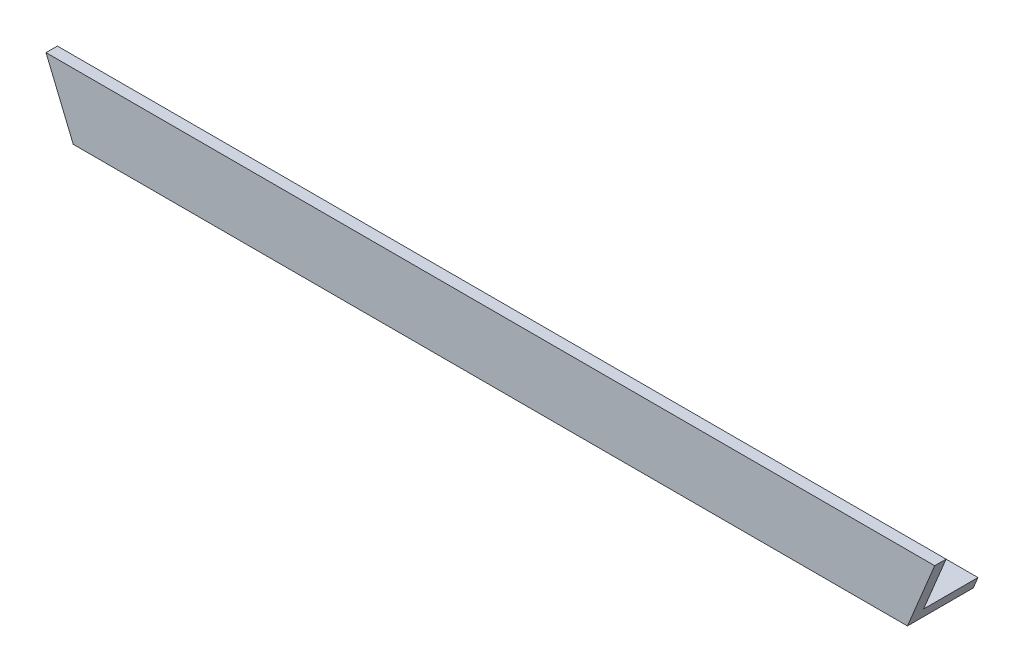
ISO-10303-21;
HEADER;
FILE_DESCRIPTION(('STEP AP214'),'2;1');
FILE_NAME('part.step','',(''),(''),'','','');
FILE_SCHEMA(('AUTOMOTIVE_DESIGN { 1 0 10303 214 1 1 1 1 }'));
ENDSEC;
DATA;
#1=APPLICATION_CONTEXT('core data for automotive mechanical design processes');
#2=APPLICATION_PROTOCOL_DEFINITION('international standard','automotive_design',2000,#1);
#3=PRODUCT_CONTEXT('',#1,'mechanical');
#4=PRODUCT('Part','Part','',(#3));
#5=PRODUCT_RELATED_PRODUCT_CATEGORY('part','',(#4));
#6=PRODUCT_DEFINITION_FORMATION('','',#4);
#7=PRODUCT_DEFINITION_CONTEXT('part definition',#1,'design');
#8=PRODUCT_DEFINITION('design','',#6,#7);
#9=PRODUCT_DEFINITION_SHAPE('','',#8);
#10=(LENGTH_UNIT() NAMED_UNIT(*) SI_UNIT(.MILLI.,.METRE.));
#11=(NAMED_UNIT(*) PLANE_ANGLE_UNIT() SI_UNIT($,.RADIAN.));
#12=(NAMED_UNIT(*) SI_UNIT($,.STERADIAN.) SOLID_ANGLE_UNIT());
#13=UNCERTAINTY_MEASURE_WITH_UNIT(LENGTH_MEASURE(1.E-05),#10,'distance_accuracy_value','');
#14=(GEOMETRIC_REPRESENTATION_CONTEXT(3) GLOBAL_UNCERTAINTY_ASSIGNED_CONTEXT((#13)) GLOBAL_UNIT_ASSIGNED_CONTEXT((#10,
#11,#12)) REPRESENTATION_CONTEXT('',''));
#15=CARTESIAN_POINT('',(0.,0.,0.));
#16=DIRECTION('',(0.,0.,1.));
#17=DIRECTION('',(1.,0.,0.));
#18=AXIS2_PLACEMENT_3D('',#15,#16,#17);
#19=CARTESIAN_POINT('',(270.,20.,0.));
#20=DIRECTION('',(0.,0.,-1.));
#21=DIRECTION('',(0.,1.,0.));
#22=AXIS2_PLACEMENT_3D('',#19,#20,#21);
#23=PLANE('',#22);
#24=DIRECTION('',(0.382683432365092,0.923879532511286,0.));
#25=VECTOR('',#24,1.);
#26=CARTESIAN_POINT('',(270.,20.,0.));
#27=LINE('',#26,#25);
#28=CARTESIAN_POINT('',(261.715728752538,0.,0.));
#29=VERTEX_POINT('',#28);
#30=CARTESIAN_POINT('',(270.,20.,0.));
#31=VERTEX_POINT('',#30);
#32=EDGE_CURVE('E89',#29,#31,#27,.T.);
#33=ORIENTED_EDGE('',*,*,#32,.T.);
#34=DIRECTION('',(-1.,0.,0.));
#35=VECTOR('',#34,1.);
#36=CARTESIAN_POINT('',(270.,20.,0.));
#37=LINE('',#36,#35);
#38=CARTESIAN_POINT('',(0.,20.,0.));
#39=VERTEX_POINT('',#38);
#40=EDGE_CURVE('E114',#31,#39,#37,.T.);
#41=ORIENTED_EDGE('',*,*,#40,.T.);
#42=DIRECTION('',(0.382683432365091,-0.923879532511286,0.));
#43=VECTOR('',#42,1.);
#44=CARTESIAN_POINT('',(0.,20.,0.));
#45=LINE('',#44,#43);
#46=CARTESIAN_POINT('',(8.28427124746192,0.,0.));
#47=VERTEX_POINT('',#46);
#48=EDGE_CURVE('E130',#39,#47,#45,.T.);
#49=ORIENTED_EDGE('',*,*,#48,.T.);
#50=DIRECTION('',(-1.,0.,0.));
#51=VECTOR('',#50,1.);
#52=CARTESIAN_POINT('',(270.,0.,0.));
#53=LINE('',#52,#51);
#54=EDGE_CURVE('E11',#29,#47,#53,.T.);
#55=ORIENTED_EDGE('',*,*,#54,.F.);
#56=EDGE_LOOP('',(#33,#41,#49,#55));
#57=FACE_BOUND('',#56,.T.);
#58=ADVANCED_FACE('F37',(#57),#23,.F.);
#59=CARTESIAN_POINT('',(270.,0.,0.));
#60=DIRECTION('',(0.,1.,0.));
#61=DIRECTION('',(0.,0.,1.));
#62=AXIS2_PLACEMENT_3D('',#59,#60,#61);
#63=PLANE('',#62);
#64=DIRECTION('',(0.,0.,1.));
#65=VECTOR('',#64,1.);
#66=CARTESIAN_POINT('',(261.715728752538,0.,-20.));
#67=LINE('',#66,#65);
#68=CARTESIAN_POINT('',(261.715728752538,0.,-20.));
#69=VERTEX_POINT('',#68);
#70=EDGE_CURVE('E83',#69,#29,#67,.T.);
#71=ORIENTED_EDGE('',*,*,#70,.T.);
#72=ORIENTED_EDGE('',*,*,#54,.T.);
#73=DIRECTION('',(0.,0.,1.));
#74=VECTOR('',#73,1.);
#75=CARTESIAN_POINT('',(8.28427124746192,0.,-20.));
#76=LINE('',#75,#74);
#77=CARTESIAN_POINT('',(8.28427124746192,0.,-20.));
#78=VERTEX_POINT('',#77);
#79=EDGE_CURVE('E105',#78,#47,#76,.T.);
#80=ORIENTED_EDGE('',*,*,#79,.F.);
#81=DIRECTION('',(-1.,0.,0.));
#82=VECTOR('',#81,1.);
#83=CARTESIAN_POINT('',(270.,0.,-20.));
#84=LINE('',#83,#82);
#85=EDGE_CURVE('E45',#69,#78,#84,.T.);
#86=ORIENTED_EDGE('',*,*,#85,.F.);
#87=EDGE_LOOP('',(#71,#72,#80,#86));
#88=FACE_BOUND('',#87,.T.);
#89=ADVANCED_FACE('F104',(#88),#63,.F.);
#90=CARTESIAN_POINT('',(270.,0.,-20.));
#91=DIRECTION('',(0.,0.,1.));
#92=DIRECTION('',(1.,0.,0.));
#93=AXIS2_PLACEMENT_3D('',#90,#91,#92);
#94=PLANE('',#93);
#95=DIRECTION('',(0.382683432365092,0.923879532511286,0.));
#96=VECTOR('',#95,1.);
#97=CARTESIAN_POINT('',(270.,20.,-20.));
#98=LINE('',#97,#96);
#99=CARTESIAN_POINT('',(263.14939581537,3.46117846701572,-20.));
#100=VERTEX_POINT('',#99);
#101=EDGE_CURVE('E86',#69,#100,#98,.T.);
#102=ORIENTED_EDGE('',*,*,#101,.F.);
#103=ORIENTED_EDGE('',*,*,#85,.T.);
#104=DIRECTION('',(0.382683432365091,-0.923879532511286,0.));
#105=VECTOR('',#104,1.);
#106=CARTESIAN_POINT('',(0.,20.,-20.));
#107=LINE('',#106,#105);
#108=CARTESIAN_POINT('',(6.85060418463029,3.46117846701572,-20.));
#109=VERTEX_POINT('',#108);
#110=EDGE_CURVE('E128',#109,#78,#107,.T.);
#111=ORIENTED_EDGE('',*,*,#110,.F.);
#112=DIRECTION('',(-1.,0.,0.));
#113=VECTOR('',#112,1.);
#114=CARTESIAN_POINT('',(270.,3.46117846701572,-20.));
#115=LINE('',#114,#113);
#116=EDGE_CURVE('E101',#100,#109,#115,.T.);
#117=ORIENTED_EDGE('',*,*,#116,.F.);
#118=EDGE_LOOP('',(#102,#103,#111,#117));
#119=FACE_BOUND('',#118,.T.);
#120=ADVANCED_FACE('F98',(#119),#94,.F.);
#121=CARTESIAN_POINT('',(270.,3.46117846701572,-20.));
#122=DIRECTION('',(0.,-1.,0.));
#123=DIRECTION('',(0.,0.,-1.));
#124=AXIS2_PLACEMENT_3D('',#121,#122,#123);
#125=PLANE('',#124);
#126=DIRECTION('',(0.,0.,1.));
#127=VECTOR('',#126,1.);
#128=CARTESIAN_POINT('',(263.14939581537,3.46117846701572,-20.));
#129=LINE('',#128,#127);
#130=CARTESIAN_POINT('',(263.14939581537,3.46117846701572,-3.46117846701572));
#131=VERTEX_POINT('',#130);
#132=EDGE_CURVE('E121',#100,#131,#129,.T.);
#133=ORIENTED_EDGE('',*,*,#132,.F.);
#134=ORIENTED_EDGE('',*,*,#116,.T.);
#135=DIRECTION('',(0.,0.,-1.));
#136=VECTOR('',#135,1.);
#137=CARTESIAN_POINT('',(6.85060418463029,3.46117846701572,-20.));
#138=LINE('',#137,#136);
#139=CARTESIAN_POINT('',(6.8506041846303,3.46117846701571,-3.46117846701572));
#140=VERTEX_POINT('',#139);
#141=EDGE_CURVE('E125',#140,#109,#138,.T.);
#142=ORIENTED_EDGE('',*,*,#141,.F.);
#143=DIRECTION('',(-1.,0.,0.));
#144=VECTOR('',#143,1.);
#145=CARTESIAN_POINT('',(270.,3.46117846701572,-3.46117846701572));
#146=LINE('',#145,#144);
#147=EDGE_CURVE('E106',#131,#140,#146,.T.);
#148=ORIENTED_EDGE('',*,*,#147,.F.);
#149=EDGE_LOOP('',(#133,#134,#142,#148));
#150=FACE_BOUND('',#149,.T.);
#151=ADVANCED_FACE('F147',(#150),#125,.F.);
#152=CARTESIAN_POINT('',(270.,3.46117846701572,-3.46117846701572));
#153=DIRECTION('',(0.,0.,1.));
#154=DIRECTION('',(1.,0.,0.));
#155=AXIS2_PLACEMENT_3D('',#152,#153,#154);
#156=PLANE('',#155);
#157=DIRECTION('',(0.382683432365092,0.923879532511286,0.));
#158=VECTOR('',#157,1.);
#159=CARTESIAN_POINT('',(264.152643570596,5.88323280410424,-3.46117846701572));
#160=LINE('',#159,#158);
#161=CARTESIAN_POINT('',(270.,20.,-3.46117846701572));
#162=VERTEX_POINT('',#161);
#163=EDGE_CURVE('E51',#131,#162,#160,.T.);
#164=ORIENTED_EDGE('',*,*,#163,.F.);
#165=ORIENTED_EDGE('',*,*,#147,.T.);
#166=DIRECTION('',(0.382683432365091,-0.923879532511287,0.));
#167=VECTOR('',#166,1.);
#168=CARTESIAN_POINT('',(45.3879409692199,-89.5761826560799,-3.46117846701572));
#169=LINE('',#168,#167);
#170=CARTESIAN_POINT('',(0.,20.,-3.46117846701572));
#171=VERTEX_POINT('',#170);
#172=EDGE_CURVE('E93',#171,#140,#169,.T.);
#173=ORIENTED_EDGE('',*,*,#172,.F.);
#174=DIRECTION('',(-1.,0.,0.));
#175=VECTOR('',#174,1.);
#176=CARTESIAN_POINT('',(270.,20.,-3.46117846701572));
#177=LINE('',#176,#175);
#178=EDGE_CURVE('E111',#162,#171,#177,.T.);
#179=ORIENTED_EDGE('',*,*,#178,.F.);
#180=EDGE_LOOP('',(#164,#165,#173,#179));
#181=FACE_BOUND('',#180,.T.);
#182=ADVANCED_FACE('F144',(#181),#156,.F.);
#183=CARTESIAN_POINT('',(270.,20.,-3.46117846701572));
#184=DIRECTION('',(0.,-1.,0.));
#185=DIRECTION('',(0.,0.,-1.));
#186=AXIS2_PLACEMENT_3D('',#183,#184,#185);
#187=PLANE('',#186);
#188=DIRECTION('',(0.,0.,1.));
#189=VECTOR('',#188,1.);
#190=CARTESIAN_POINT('',(0.,20.,-3.46117846701572));
#191=LINE('',#190,#189);
#192=EDGE_CURVE('E118',#171,#39,#191,.T.);
#193=ORIENTED_EDGE('',*,*,#192,.T.);
#194=ORIENTED_EDGE('',*,*,#40,.F.);
#195=DIRECTION('',(0.,0.,1.));
#196=VECTOR('',#195,1.);
#197=CARTESIAN_POINT('',(270.,20.,-3.46117846701572));
#198=LINE('',#197,#196);
#199=EDGE_CURVE('E117',#162,#31,#198,.T.);
#200=ORIENTED_EDGE('',*,*,#199,.F.);
#201=ORIENTED_EDGE('',*,*,#178,.T.);
#202=EDGE_LOOP('',(#193,#194,#200,#201));
#203=FACE_BOUND('',#202,.T.);
#204=ADVANCED_FACE('F138',(#203),#187,.F.);
#205=CARTESIAN_POINT('',(0.,20.,-20.));
#206=DIRECTION('',(-0.923879532511287,-0.382683432365091,0.));
#207=DIRECTION('',(0.382683432365091,-0.923879532511287,0.));
#208=AXIS2_PLACEMENT_3D('',#205,#206,#207);
#209=PLANE('',#208);
#210=ORIENTED_EDGE('',*,*,#141,.T.);
#211=ORIENTED_EDGE('',*,*,#110,.T.);
#212=ORIENTED_EDGE('',*,*,#79,.T.);
#213=ORIENTED_EDGE('',*,*,#48,.F.);
#214=ORIENTED_EDGE('',*,*,#192,.F.);
#215=ORIENTED_EDGE('',*,*,#172,.T.);
#216=EDGE_LOOP('',(#210,#211,#212,#213,#214,#215));
#217=FACE_BOUND('',#216,.T.);
#218=ADVANCED_FACE('F141',(#217),#209,.T.);
#219=CARTESIAN_POINT('',(270.,20.,-20.));
#220=DIRECTION('',(0.923879532511286,-0.382683432365092,0.));
#221=DIRECTION('',(0.382683432365092,0.923879532511286,0.));
#222=AXIS2_PLACEMENT_3D('',#219,#220,#221);
#223=PLANE('',#222);
#224=ORIENTED_EDGE('',*,*,#132,.T.);
#225=ORIENTED_EDGE('',*,*,#163,.T.);
#226=ORIENTED_EDGE('',*,*,#199,.T.);
#227=ORIENTED_EDGE('',*,*,#32,.F.);
#228=ORIENTED_EDGE('',*,*,#70,.F.);
#229=ORIENTED_EDGE('',*,*,#101,.T.);
#230=EDGE_LOOP('',(#224,#225,#226,#227,#228,#229));
#231=FACE_BOUND('',#230,.T.);
#232=ADVANCED_FACE('F85',(#231),#223,.T.);
#233=CLOSED_SHELL('',(#58,#89,#120,#151,#182,#204,#218,#232));
#234=MANIFOLD_SOLID_BREP('B2',#233);
#235=ADVANCED_BREP_SHAPE_REPRESENTATION('',(#18,#234),#14);
#236=SHAPE_DEFINITION_REPRESENTATION(#9,#235);
ENDSEC;
END-ISO-10303-21;
